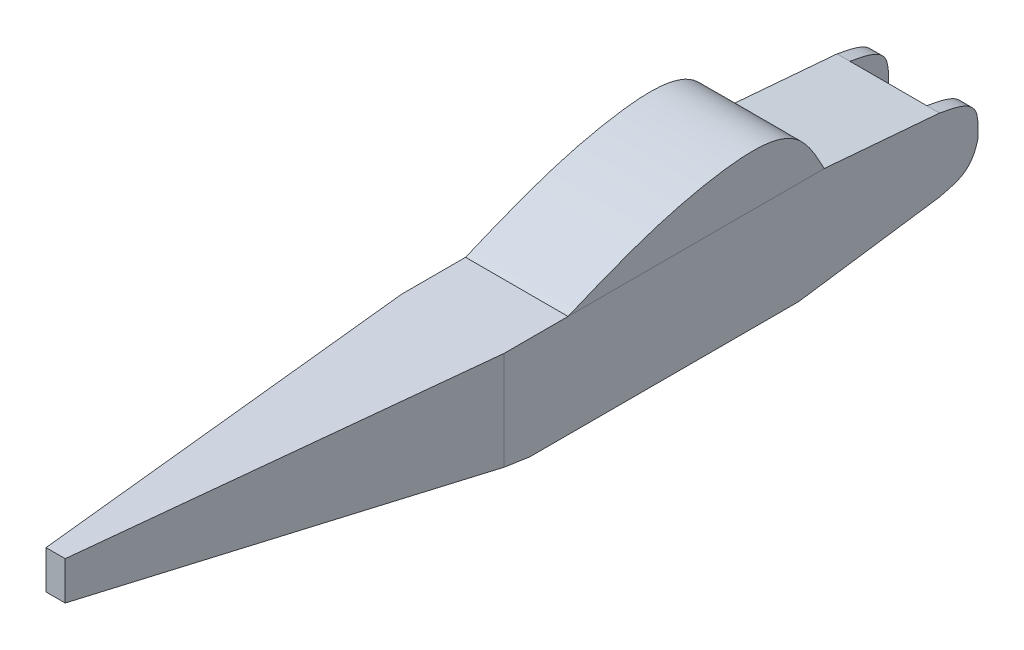
ISO-10303-21;
HEADER;
FILE_DESCRIPTION(('STEP AP214'),'2;1');
FILE_NAME('part.step','',(''),(''),'','','');
FILE_SCHEMA(('AUTOMOTIVE_DESIGN { 1 0 10303 214 1 1 1 1 }'));
ENDSEC;
DATA;
#1=APPLICATION_CONTEXT('core data for automotive mechanical design processes');
#2=APPLICATION_PROTOCOL_DEFINITION('international standard','automotive_design',2000,#1);
#3=PRODUCT_CONTEXT('',#1,'mechanical');
#4=PRODUCT('Part','Part','',(#3));
#5=PRODUCT_RELATED_PRODUCT_CATEGORY('part','',(#4));
#6=PRODUCT_DEFINITION_FORMATION('','',#4);
#7=PRODUCT_DEFINITION_CONTEXT('part definition',#1,'design');
#8=PRODUCT_DEFINITION('design','',#6,#7);
#9=PRODUCT_DEFINITION_SHAPE('','',#8);
#10=(LENGTH_UNIT() NAMED_UNIT(*) SI_UNIT(.MILLI.,.METRE.));
#11=(NAMED_UNIT(*) PLANE_ANGLE_UNIT() SI_UNIT($,.RADIAN.));
#12=(NAMED_UNIT(*) SI_UNIT($,.STERADIAN.) SOLID_ANGLE_UNIT());
#13=UNCERTAINTY_MEASURE_WITH_UNIT(LENGTH_MEASURE(1.E-05),#10,'distance_accuracy_value','');
#14=(GEOMETRIC_REPRESENTATION_CONTEXT(3) GLOBAL_UNCERTAINTY_ASSIGNED_CONTEXT((#13)) GLOBAL_UNIT_ASSIGNED_CONTEXT((#10,
#11,#12)) REPRESENTATION_CONTEXT('',''));
#15=CARTESIAN_POINT('',(0.,0.,0.));
#16=DIRECTION('',(0.,0.,1.));
#17=DIRECTION('',(1.,0.,0.));
#18=AXIS2_PLACEMENT_3D('',#15,#16,#17);
#19=CARTESIAN_POINT('',(80.,0.,0.));
#20=CARTESIAN_POINT('',(80.,11.9014593380871,6.29429922399345));
#21=CARTESIAN_POINT('',(80.,43.0492914360953,22.7673862492256));
#22=CARTESIAN_POINT('',(80.,38.0082211599049,108.644216453496));
#23=CARTESIAN_POINT('',(80.,15.2059546257476,163.451278249423));
#24=CARTESIAN_POINT('',(80.,0.,200.));
#25=B_SPLINE_CURVE_WITH_KNOTS('',3,(#19,#20,#21,#22,#23,#24),.UNSPECIFIED.,.F.,.F.,(4,1,1,4),
(0.,0.170815498021936,0.447048744274421,1.),.UNSPECIFIED.);
#26=DIRECTION('',(-1.,0.,0.));
#27=VECTOR('',#26,1.);
#28=SURFACE_OF_LINEAR_EXTRUSION('',#25,#27);
#29=CARTESIAN_POINT('',(0.,0.,0.));
#30=CARTESIAN_POINT('',(0.,11.9014593380871,6.29429922399345));
#31=CARTESIAN_POINT('',(0.,43.0492914360953,22.7673862492256));
#32=CARTESIAN_POINT('',(0.,38.0082211599049,108.644216453496));
#33=CARTESIAN_POINT('',(0.,15.2059546257476,163.451278249423));
#34=CARTESIAN_POINT('',(0.,0.,200.));
#35=B_SPLINE_CURVE_WITH_KNOTS('',3,(#29,#30,#31,#32,#33,#34),.UNSPECIFIED.,.F.,.F.,(4,1,1,4),
(0.,0.170815498021936,0.447048744274421,1.),.UNSPECIFIED.);
#36=CARTESIAN_POINT('',(0.,0.,0.));
#37=VERTEX_POINT('',#36);
#38=CARTESIAN_POINT('',(0.,0.,200.));
#39=VERTEX_POINT('',#38);
#40=EDGE_CURVE('E67',#37,#39,#35,.T.);
#41=ORIENTED_EDGE('',*,*,#40,.T.);
#42=DIRECTION('',(-1.,0.,0.));
#43=VECTOR('',#42,1.);
#44=CARTESIAN_POINT('',(80.,0.,200.));
#45=LINE('',#44,#43);
#46=CARTESIAN_POINT('',(80.,0.,200.));
#47=VERTEX_POINT('',#46);
#48=EDGE_CURVE('E12',#47,#39,#45,.T.);
#49=ORIENTED_EDGE('',*,*,#48,.F.);
#50=CARTESIAN_POINT('',(80.,0.,0.));
#51=VERTEX_POINT('',#50);
#52=EDGE_CURVE('E69',#51,#47,#25,.T.);
#53=ORIENTED_EDGE('',*,*,#52,.F.);
#54=DIRECTION('',(-1.,0.,0.));
#55=VECTOR('',#54,1.);
#56=CARTESIAN_POINT('',(80.,0.,0.));
#57=LINE('',#56,#55);
#58=EDGE_CURVE('E47',#51,#37,#57,.T.);
#59=ORIENTED_EDGE('',*,*,#58,.T.);
#60=EDGE_LOOP('',(#41,#49,#53,#59));
#61=FACE_BOUND('',#60,.T.);
#62=ADVANCED_FACE('F39',(#61),#28,.F.);
#63=CARTESIAN_POINT('',(80.,0.,200.));
#64=DIRECTION('',(0.,1.,0.));
#65=DIRECTION('',(0.,0.,1.));
#66=AXIS2_PLACEMENT_3D('',#63,#64,#65);
#67=PLANE('',#66);
#68=DIRECTION('',(0.,0.,-1.));
#69=VECTOR('',#68,1.);
#70=CARTESIAN_POINT('',(0.,0.,200.));
#71=LINE('',#70,#69);
#72=EDGE_CURVE('E64',#39,#37,#71,.T.);
#73=ORIENTED_EDGE('',*,*,#72,.T.);
#74=ORIENTED_EDGE('',*,*,#58,.F.);
#75=DIRECTION('',(0.,0.,-1.));
#76=VECTOR('',#75,1.);
#77=CARTESIAN_POINT('',(80.,0.,200.));
#78=LINE('',#77,#76);
#79=EDGE_CURVE('E53',#47,#51,#78,.T.);
#80=ORIENTED_EDGE('',*,*,#79,.F.);
#81=ORIENTED_EDGE('',*,*,#48,.T.);
#82=EDGE_LOOP('',(#73,#74,#80,#81));
#83=FACE_BOUND('',#82,.T.);
#84=ADVANCED_FACE('F72',(#83),#67,.F.);
#85=CARTESIAN_POINT('',(80.,35.1265905031986,95.4612737719037));
#86=DIRECTION('',(-1.,0.,0.));
#87=DIRECTION('',(0.,0.,1.));
#88=AXIS2_PLACEMENT_3D('',#85,#86,#87);
#89=PLANE('',#88);
#90=ORIENTED_EDGE('',*,*,#52,.T.);
#91=ORIENTED_EDGE('',*,*,#79,.T.);
#92=EDGE_LOOP('',(#90,#91));
#93=FACE_BOUND('',#92,.T.);
#94=ADVANCED_FACE('F88',(#93),#89,.F.);
#95=CARTESIAN_POINT('',(0.,35.1265905031986,95.4612737719037));
#96=DIRECTION('',(-1.,0.,0.));
#97=DIRECTION('',(0.,0.,1.));
#98=AXIS2_PLACEMENT_3D('',#95,#96,#97);
#99=PLANE('',#98);
#100=ORIENTED_EDGE('',*,*,#40,.F.);
#101=ORIENTED_EDGE('',*,*,#72,.F.);
#102=EDGE_LOOP('',(#100,#101));
#103=FACE_BOUND('',#102,.T.);
#104=ADVANCED_FACE('F65',(#103),#99,.T.);
#105=CLOSED_SHELL('',(#62,#84,#94,#104));
#106=MANIFOLD_SOLID_BREP('B2',#105);
#107=CARTESIAN_POINT('',(80.,-10.,-120.));
#108=DIRECTION('',(0.,0.,1.));
#109=DIRECTION('',(1.,0.,0.));
#110=AXIS2_PLACEMENT_3D('',#107,#108,#109);
#111=PLANE('',#110);
#112=DIRECTION('',(1.,0.,0.));
#113=VECTOR('',#112,1.);
#114=CARTESIAN_POINT('',(-100.,-28.8563423839718,-120.));
#115=LINE('',#114,#113);
#116=CARTESIAN_POINT('',(0.,-28.8563423839719,-120.));
#117=VERTEX_POINT('',#116);
#118=CARTESIAN_POINT('',(9.99999999999999,-28.8563423839719,-120.));
#119=VERTEX_POINT('',#118);
#120=EDGE_CURVE('E302',#117,#119,#115,.T.);
#121=ORIENTED_EDGE('',*,*,#120,.T.);
#122=DIRECTION('',(0.,-1.,0.));
#123=VECTOR('',#122,1.);
#124=CARTESIAN_POINT('',(9.99999999999999,-10.,-120.));
#125=LINE('',#124,#123);
#126=CARTESIAN_POINT('',(9.99999999999999,-39.7725216168353,-120.));
#127=VERTEX_POINT('',#126);
#128=EDGE_CURVE('E251',#119,#127,#125,.T.);
#129=ORIENTED_EDGE('',*,*,#128,.T.);
#130=DIRECTION('',(1.,0.,0.));
#131=VECTOR('',#130,1.);
#132=CARTESIAN_POINT('',(-100.,-39.7725216168353,-120.));
#133=LINE('',#132,#131);
#134=CARTESIAN_POINT('',(0.,-39.7725216168353,-120.));
#135=VERTEX_POINT('',#134);
#136=EDGE_CURVE('E239',#135,#127,#133,.T.);
#137=ORIENTED_EDGE('',*,*,#136,.F.);
#138=DIRECTION('',(0.,1.,0.));
#139=VECTOR('',#138,1.);
#140=CARTESIAN_POINT('',(0.,-10.,-120.));
#141=LINE('',#140,#139);
#142=EDGE_CURVE('E335',#135,#117,#141,.T.);
#143=ORIENTED_EDGE('',*,*,#142,.T.);
#144=EDGE_LOOP('',(#121,#129,#137,#143));
#145=FACE_BOUND('',#144,.T.);
#146=ADVANCED_FACE('F114',(#145),#111,.F.);
#147=CARTESIAN_POINT('',(-100.,-7.5,-90.));
#148=CARTESIAN_POINT('',(-100.,-9.78552271861447,-102.569578593505));
#149=CARTESIAN_POINT('',(-100.,-12.6209908081154,-118.163665106004));
#150=CARTESIAN_POINT('',(-100.,-26.2189816750571,-119.701695557672));
#151=CARTESIAN_POINT('',(-100.,-28.8563423839719,-120.));
#152=B_SPLINE_CURVE_WITH_KNOTS('',3,(#147,#148,#149,#150,#151),.UNSPECIFIED.,.F.,.F.,(4,1,4),
(0.,0.806047765826455,1.),.UNSPECIFIED.);
#153=DIRECTION('',(1.,0.,0.));
#154=VECTOR('',#153,1.);
#155=SURFACE_OF_LINEAR_EXTRUSION('',#152,#154);
#156=DIRECTION('',(1.,0.,0.));
#157=VECTOR('',#156,1.);
#158=CARTESIAN_POINT('',(-100.,-7.5,-90.));
#159=LINE('',#158,#157);
#160=CARTESIAN_POINT('',(0.,-7.5,-90.));
#161=VERTEX_POINT('',#160);
#162=CARTESIAN_POINT('',(10.,-7.50000000000001,-90.));
#163=VERTEX_POINT('',#162);
#164=EDGE_CURVE('E295',#161,#163,#159,.T.);
#165=ORIENTED_EDGE('',*,*,#164,.T.);
#166=CARTESIAN_POINT('',(9.99999999999999,-7.5,-90.));
#167=CARTESIAN_POINT('',(9.99999999999999,-9.78552271861447,-102.569578593505));
#168=CARTESIAN_POINT('',(9.99999999999999,-12.6209908081154,-118.163665106004));
#169=CARTESIAN_POINT('',(9.99999999999999,-26.2189816750571,-119.701695557672));
#170=CARTESIAN_POINT('',(9.99999999999999,-28.8563423839719,-120.));
#171=B_SPLINE_CURVE_WITH_KNOTS('',3,(#166,#167,#168,#169,#170),.UNSPECIFIED.,.F.,.F.,(4,1,4),
(0.,0.806047765826455,1.),.UNSPECIFIED.);
#172=EDGE_CURVE('E234',#163,#119,#171,.T.);
#173=ORIENTED_EDGE('',*,*,#172,.T.);
#174=ORIENTED_EDGE('',*,*,#120,.F.);
#175=CARTESIAN_POINT('',(0.,-7.5,-90.));
#176=CARTESIAN_POINT('',(0.,-9.78552271861447,-102.569578593505));
#177=CARTESIAN_POINT('',(0.,-12.6209908081154,-118.163665106004));
#178=CARTESIAN_POINT('',(0.,-26.2189816750571,-119.701695557672));
#179=CARTESIAN_POINT('',(0.,-28.8563423839719,-120.));
#180=B_SPLINE_CURVE_WITH_KNOTS('',3,(#175,#176,#177,#178,#179),.UNSPECIFIED.,.F.,.F.,(4,1,4),
(0.,0.806047765826455,1.),.UNSPECIFIED.);
#181=EDGE_CURVE('E373',#117,#161,#180,.F.);
#182=ORIENTED_EDGE('',*,*,#181,.T.);
#183=EDGE_LOOP('',(#165,#173,#174,#182));
#184=FACE_BOUND('',#183,.T.);
#185=ADVANCED_FACE('F285',(#184),#155,.F.);
#186=CARTESIAN_POINT('',(-100.,-39.7725216168353,-120.));
#187=CARTESIAN_POINT('',(-100.,-60.6770112525162,-114.843141558681));
#188=CARTESIAN_POINT('',(-100.,-60.9123602708052,-101.38592470322));
#189=CARTESIAN_POINT('',(-100.,-64.2857142857143,-90.));
#190=B_SPLINE_CURVE_WITH_KNOTS('',3,(#186,#187,#188,#189),.UNSPECIFIED.,.F.,.F.,(4,4),(0.,1.),.UNSPECIFIED.);
#191=DIRECTION('',(1.,0.,0.));
#192=VECTOR('',#191,1.);
#193=SURFACE_OF_LINEAR_EXTRUSION('',#190,#192);
#194=ORIENTED_EDGE('',*,*,#136,.T.);
#195=CARTESIAN_POINT('',(9.99999999999999,-39.7725216168353,-120.));
#196=CARTESIAN_POINT('',(9.99999999999999,-60.6770112525162,-114.843141558681));
#197=CARTESIAN_POINT('',(9.99999999999999,-60.9123602708052,-101.38592470322));
#198=CARTESIAN_POINT('',(9.99999999999999,-64.2857142857143,-90.));
#199=B_SPLINE_CURVE_WITH_KNOTS('',3,(#195,#196,#197,#198),.UNSPECIFIED.,.F.,.F.,(4,4),(0.,1.),.UNSPECIFIED.);
#200=CARTESIAN_POINT('',(10.,-64.2857142857143,-90.));
#201=VERTEX_POINT('',#200);
#202=EDGE_CURVE('E37',#127,#201,#199,.T.);
#203=ORIENTED_EDGE('',*,*,#202,.T.);
#204=DIRECTION('',(1.,0.,0.));
#205=VECTOR('',#204,1.);
#206=CARTESIAN_POINT('',(-100.,-64.2857142857143,-90.));
#207=LINE('',#206,#205);
#208=CARTESIAN_POINT('',(0.,-64.2857142857143,-90.));
#209=VERTEX_POINT('',#208);
#210=EDGE_CURVE('E138',#209,#201,#207,.T.);
#211=ORIENTED_EDGE('',*,*,#210,.F.);
#212=CARTESIAN_POINT('',(0.,-39.7725216168353,-120.));
#213=CARTESIAN_POINT('',(0.,-60.6770112525162,-114.843141558681));
#214=CARTESIAN_POINT('',(0.,-60.9123602708052,-101.38592470322));
#215=CARTESIAN_POINT('',(0.,-64.2857142857143,-90.));
#216=B_SPLINE_CURVE_WITH_KNOTS('',3,(#212,#213,#214,#215),.UNSPECIFIED.,.F.,.F.,(4,4),(0.,1.),.UNSPECIFIED.);
#217=EDGE_CURVE('E377',#209,#135,#216,.F.);
#218=ORIENTED_EDGE('',*,*,#217,.T.);
#219=EDGE_LOOP('',(#194,#203,#211,#218));
#220=FACE_BOUND('',#219,.T.);
#221=ADVANCED_FACE('F237',(#220),#193,.F.);
#222=CARTESIAN_POINT('',(80.,0.,560.));
#223=DIRECTION('',(0.,-1.,0.));
#224=DIRECTION('',(0.,0.,-1.));
#225=AXIS2_PLACEMENT_3D('',#222,#223,#224);
#226=PLANE('',#225);
#227=DIRECTION('',(0.,0.,1.));
#228=VECTOR('',#227,1.);
#229=CARTESIAN_POINT('',(0.,0.,560.));
#230=LINE('',#229,#228);
#231=CARTESIAN_POINT('',(0.,0.,0.));
#232=VERTEX_POINT('',#231);
#233=CARTESIAN_POINT('',(0.,0.,250.));
#234=VERTEX_POINT('',#233);
#235=EDGE_CURVE('E327',#232,#234,#230,.T.);
#236=ORIENTED_EDGE('',*,*,#235,.T.);
#237=DIRECTION('',(-0.104267266743309,0.,-0.99454931355156));
#238=VECTOR('',#237,1.);
#239=CARTESIAN_POINT('',(0.,0.,250.));
#240=LINE('',#239,#238);
#241=CARTESIAN_POINT('',(32.5,0.,560.));
#242=VERTEX_POINT('',#241);
#243=EDGE_CURVE('E314',#242,#234,#240,.T.);
#244=ORIENTED_EDGE('',*,*,#243,.F.);
#245=DIRECTION('',(-1.,0.,0.));
#246=VECTOR('',#245,1.);
#247=CARTESIAN_POINT('',(80.,0.,560.));
#248=LINE('',#247,#246);
#249=CARTESIAN_POINT('',(47.5,0.,560.));
#250=VERTEX_POINT('',#249);
#251=EDGE_CURVE('E365',#250,#242,#248,.T.);
#252=ORIENTED_EDGE('',*,*,#251,.F.);
#253=DIRECTION('',(-0.104267266743309,0.,0.99454931355156));
#254=VECTOR('',#253,1.);
#255=CARTESIAN_POINT('',(47.5,0.,560.));
#256=LINE('',#255,#254);
#257=CARTESIAN_POINT('',(80.,0.,250.));
#258=VERTEX_POINT('',#257);
#259=EDGE_CURVE('E309',#258,#250,#256,.T.);
#260=ORIENTED_EDGE('',*,*,#259,.F.);
#261=DIRECTION('',(0.,0.,1.));
#262=VECTOR('',#261,1.);
#263=CARTESIAN_POINT('',(80.,0.,560.));
#264=LINE('',#263,#262);
#265=CARTESIAN_POINT('',(80.,0.,0.));
#266=VERTEX_POINT('',#265);
#267=EDGE_CURVE('E339',#266,#258,#264,.T.);
#268=ORIENTED_EDGE('',*,*,#267,.F.);
#269=DIRECTION('',(-1.,0.,0.));
#270=VECTOR('',#269,1.);
#271=CARTESIAN_POINT('',(80.,0.,0.));
#272=LINE('',#271,#270);
#273=EDGE_CURVE('E354',#266,#232,#272,.T.);
#274=ORIENTED_EDGE('',*,*,#273,.T.);
#275=EDGE_LOOP('',(#236,#244,#252,#260,#268,#274));
#276=FACE_BOUND('',#275,.T.);
#277=ADVANCED_FACE('F116',(#276),#226,.F.);
#278=CARTESIAN_POINT('',(80.,-30.,560.));
#279=DIRECTION('',(0.,0.,-1.));
#280=DIRECTION('',(-1.,0.,0.));
#281=AXIS2_PLACEMENT_3D('',#278,#279,#280);
#282=PLANE('',#281);
#283=ORIENTED_EDGE('',*,*,#251,.T.);
#284=DIRECTION('',(0.,1.,0.));
#285=VECTOR('',#284,1.);
#286=CARTESIAN_POINT('',(32.5,-80.,560.));
#287=LINE('',#286,#285);
#288=CARTESIAN_POINT('',(32.5,-30.,560.));
#289=VERTEX_POINT('',#288);
#290=EDGE_CURVE('E317',#289,#242,#287,.T.);
#291=ORIENTED_EDGE('',*,*,#290,.F.);
#292=DIRECTION('',(-1.,0.,0.));
#293=VECTOR('',#292,1.);
#294=CARTESIAN_POINT('',(80.,-30.,560.));
#295=LINE('',#294,#293);
#296=CARTESIAN_POINT('',(47.5,-30.,560.));
#297=VERTEX_POINT('',#296);
#298=EDGE_CURVE('E362',#297,#289,#295,.T.);
#299=ORIENTED_EDGE('',*,*,#298,.F.);
#300=DIRECTION('',(0.,1.,0.));
#301=VECTOR('',#300,1.);
#302=CARTESIAN_POINT('',(47.5,-80.,560.));
#303=LINE('',#302,#301);
#304=EDGE_CURVE('E316',#297,#250,#303,.T.);
#305=ORIENTED_EDGE('',*,*,#304,.T.);
#306=EDGE_LOOP('',(#283,#291,#299,#305));
#307=FACE_BOUND('',#306,.T.);
#308=ADVANCED_FACE('F422',(#307),#282,.F.);
#309=CARTESIAN_POINT('',(80.,-80.,230.));
#310=DIRECTION('',(0.,0.988715504224767,-0.149805379427995));
#311=DIRECTION('',(0.,0.149805379427995,0.988715504224767));
#312=AXIS2_PLACEMENT_3D('',#309,#310,#311);
#313=PLANE('',#312);
#314=ORIENTED_EDGE('',*,*,#298,.T.);
#315=DIRECTION('',(-0.103103241444561,-0.149007015607524,-0.983446303009658));
#316=VECTOR('',#315,1.);
#317=CARTESIAN_POINT('',(-1.22406262842661,-78.7387385305933,238.324325698085));
#318=LINE('',#317,#316);
#319=CARTESIAN_POINT('',(0.,-76.969696969697,250.));
#320=VERTEX_POINT('',#319);
#321=EDGE_CURVE('E319',#289,#320,#318,.T.);
#322=ORIENTED_EDGE('',*,*,#321,.T.);
#323=DIRECTION('',(0.,-0.149805379427995,-0.988715504224767));
#324=VECTOR('',#323,1.);
#325=CARTESIAN_POINT('',(0.,-80.,230.));
#326=LINE('',#325,#324);
#327=CARTESIAN_POINT('',(0.,-80.,230.));
#328=VERTEX_POINT('',#327);
#329=EDGE_CURVE('E330',#320,#328,#326,.T.);
#330=ORIENTED_EDGE('',*,*,#329,.T.);
#331=DIRECTION('',(-1.,0.,0.));
#332=VECTOR('',#331,1.);
#333=CARTESIAN_POINT('',(80.,-80.,230.));
#334=LINE('',#333,#332);
#335=CARTESIAN_POINT('',(80.,-80.,230.));
#336=VERTEX_POINT('',#335);
#337=EDGE_CURVE('E359',#336,#328,#334,.T.);
#338=ORIENTED_EDGE('',*,*,#337,.F.);
#339=DIRECTION('',(0.,-0.149805379427995,-0.988715504224767));
#340=VECTOR('',#339,1.);
#341=CARTESIAN_POINT('',(80.,-80.,230.));
#342=LINE('',#341,#340);
#343=CARTESIAN_POINT('',(80.,-76.969696969697,250.));
#344=VERTEX_POINT('',#343);
#345=EDGE_CURVE('E342',#344,#336,#342,.T.);
#346=ORIENTED_EDGE('',*,*,#345,.F.);
#347=DIRECTION('',(-0.103103241444561,0.149007015607524,0.983446303009658));
#348=VECTOR('',#347,1.);
#349=CARTESIAN_POINT('',(82.0744849001366,-79.9677870351625,230.212605567928));
#350=LINE('',#349,#348);
#351=EDGE_CURVE('E324',#344,#297,#350,.T.);
#352=ORIENTED_EDGE('',*,*,#351,.T.);
#353=EDGE_LOOP('',(#314,#322,#330,#338,#346,#352));
#354=FACE_BOUND('',#353,.T.);
#355=ADVANCED_FACE('F425',(#354),#313,.F.);
#356=CARTESIAN_POINT('',(80.,-80.,20.));
#357=DIRECTION('',(0.,1.,0.));
#358=DIRECTION('',(0.,0.,1.));
#359=AXIS2_PLACEMENT_3D('',#356,#357,#358);
#360=PLANE('',#359);
#361=DIRECTION('',(0.,0.,-1.));
#362=VECTOR('',#361,1.);
#363=CARTESIAN_POINT('',(0.,-80.,20.));
#364=LINE('',#363,#362);
#365=CARTESIAN_POINT('',(0.,-80.,20.));
#366=VERTEX_POINT('',#365);
#367=EDGE_CURVE('E332',#328,#366,#364,.T.);
#368=ORIENTED_EDGE('',*,*,#367,.T.);
#369=DIRECTION('',(-1.,0.,0.));
#370=VECTOR('',#369,1.);
#371=CARTESIAN_POINT('',(80.,-80.,20.));
#372=LINE('',#371,#370);
#373=CARTESIAN_POINT('',(80.,-80.,20.));
#374=VERTEX_POINT('',#373);
#375=EDGE_CURVE('E357',#374,#366,#372,.T.);
#376=ORIENTED_EDGE('',*,*,#375,.F.);
#377=DIRECTION('',(0.,0.,-1.));
#378=VECTOR('',#377,1.);
#379=CARTESIAN_POINT('',(80.,-80.,20.));
#380=LINE('',#379,#378);
#381=EDGE_CURVE('E344',#336,#374,#380,.T.);
#382=ORIENTED_EDGE('',*,*,#381,.F.);
#383=ORIENTED_EDGE('',*,*,#337,.T.);
#384=EDGE_LOOP('',(#368,#376,#382,#383));
#385=FACE_BOUND('',#384,.T.);
#386=ADVANCED_FACE('F431',(#385),#360,.F.);
#387=CARTESIAN_POINT('',(80.,-60.,-120.));
#388=DIRECTION('',(0.,0.989949493661166,0.141421356237309));
#389=DIRECTION('',(0.,-0.141421356237309,0.989949493661167));
#390=AXIS2_PLACEMENT_3D('',#387,#388,#389);
#391=PLANE('',#390);
#392=DIRECTION('',(0.,0.141421356237309,-0.989949493661166));
#393=VECTOR('',#392,1.);
#394=CARTESIAN_POINT('',(0.,-60.,-120.));
#395=LINE('',#394,#393);
#396=EDGE_CURVE('E244',#366,#209,#395,.T.);
#397=ORIENTED_EDGE('',*,*,#396,.T.);
#398=ORIENTED_EDGE('',*,*,#210,.T.);
#399=CARTESIAN_POINT('',(70.,-64.2857142857143,-90.));
#400=VERTEX_POINT('',#399);
#401=EDGE_CURVE('E222',#201,#400,#207,.T.);
#402=ORIENTED_EDGE('',*,*,#401,.T.);
#403=CARTESIAN_POINT('',(80.,-64.2857142857143,-90.));
#404=VERTEX_POINT('',#403);
#405=EDGE_CURVE('E228',#400,#404,#207,.T.);
#406=ORIENTED_EDGE('',*,*,#405,.T.);
#407=DIRECTION('',(0.,0.141421356237309,-0.989949493661166));
#408=VECTOR('',#407,1.);
#409=CARTESIAN_POINT('',(80.,-60.,-120.));
#410=LINE('',#409,#408);
#411=EDGE_CURVE('E346',#374,#404,#410,.T.);
#412=ORIENTED_EDGE('',*,*,#411,.F.);
#413=ORIENTED_EDGE('',*,*,#375,.T.);
#414=EDGE_LOOP('',(#397,#398,#402,#406,#412,#413));
#415=FACE_BOUND('',#414,.T.);
#416=ADVANCED_FACE('F241',(#415),#391,.F.);
#417=CARTESIAN_POINT('',(70.,-39.7725216168353,-120.));
#418=VERTEX_POINT('',#417);
#419=CARTESIAN_POINT('',(80.,-39.7725216168353,-120.));
#420=VERTEX_POINT('',#419);
#421=EDGE_CURVE('E245',#418,#420,#133,.T.);
#422=ORIENTED_EDGE('',*,*,#421,.F.);
#423=DIRECTION('',(0.,1.,0.));
#424=VECTOR('',#423,1.);
#425=CARTESIAN_POINT('',(70.,-10.,-120.));
#426=LINE('',#425,#424);
#427=CARTESIAN_POINT('',(70.,-28.8563423839719,-120.));
#428=VERTEX_POINT('',#427);
#429=EDGE_CURVE('E399',#418,#428,#426,.T.);
#430=ORIENTED_EDGE('',*,*,#429,.T.);
#431=CARTESIAN_POINT('',(80.,-28.8563423839718,-120.));
#432=VERTEX_POINT('',#431);
#433=EDGE_CURVE('E304',#428,#432,#115,.T.);
#434=ORIENTED_EDGE('',*,*,#433,.T.);
#435=DIRECTION('',(0.,1.,0.));
#436=VECTOR('',#435,1.);
#437=CARTESIAN_POINT('',(80.,-10.,-120.));
#438=LINE('',#437,#436);
#439=EDGE_CURVE('E349',#420,#432,#438,.T.);
#440=ORIENTED_EDGE('',*,*,#439,.F.);
#441=EDGE_LOOP('',(#422,#430,#434,#440));
#442=FACE_BOUND('',#441,.T.);
#443=ADVANCED_FACE('F398',(#442),#111,.F.);
#444=CARTESIAN_POINT('',(80.,0.,0.));
#445=DIRECTION('',(0.,-0.99654575824488,0.08304547985374));
#446=DIRECTION('',(0.,-0.08304547985374,-0.99654575824488));
#447=AXIS2_PLACEMENT_3D('',#444,#445,#446);
#448=PLANE('',#447);
#449=DIRECTION('',(0.,0.08304547985374,0.99654575824488));
#450=VECTOR('',#449,1.);
#451=CARTESIAN_POINT('',(80.,0.,0.));
#452=LINE('',#451,#450);
#453=CARTESIAN_POINT('',(80.,-7.5,-90.));
#454=VERTEX_POINT('',#453);
#455=EDGE_CURVE('E352',#454,#266,#452,.T.);
#456=ORIENTED_EDGE('',*,*,#455,.F.);
#457=CARTESIAN_POINT('',(70.,-7.50000000000001,-90.));
#458=VERTEX_POINT('',#457);
#459=EDGE_CURVE('E301',#458,#454,#159,.T.);
#460=ORIENTED_EDGE('',*,*,#459,.F.);
#461=DIRECTION('',(1.,0.,0.));
#462=VECTOR('',#461,1.);
#463=CARTESIAN_POINT('',(40.,-7.5,-90.));
#464=LINE('',#463,#462);
#465=EDGE_CURVE('E410',#458,#163,#464,.F.);
#466=ORIENTED_EDGE('',*,*,#465,.T.);
#467=ORIENTED_EDGE('',*,*,#164,.F.);
#468=DIRECTION('',(0.,0.08304547985374,0.99654575824488));
#469=VECTOR('',#468,1.);
#470=CARTESIAN_POINT('',(0.,0.,0.));
#471=LINE('',#470,#469);
#472=EDGE_CURVE('E337',#161,#232,#471,.T.);
#473=ORIENTED_EDGE('',*,*,#472,.T.);
#474=ORIENTED_EDGE('',*,*,#273,.F.);
#475=EDGE_LOOP('',(#456,#460,#466,#467,#473,#474));
#476=FACE_BOUND('',#475,.T.);
#477=ADVANCED_FACE('F408',(#476),#448,.F.);
#478=CARTESIAN_POINT('',(80.,0.,-120.));
#479=DIRECTION('',(-1.,0.,0.));
#480=DIRECTION('',(0.,0.,1.));
#481=AXIS2_PLACEMENT_3D('',#478,#479,#480);
#482=PLANE('',#481);
#483=ORIENTED_EDGE('',*,*,#411,.T.);
#484=CARTESIAN_POINT('',(80.,-39.7725216168353,-120.));
#485=CARTESIAN_POINT('',(80.,-60.6770112525162,-114.843141558681));
#486=CARTESIAN_POINT('',(80.,-60.9123602708052,-101.38592470322));
#487=CARTESIAN_POINT('',(80.,-64.2857142857143,-90.));
#488=B_SPLINE_CURVE_WITH_KNOTS('',3,(#484,#485,#486,#487),.UNSPECIFIED.,.F.,.F.,(4,4),(0.,1.),.UNSPECIFIED.);
#489=EDGE_CURVE('E292',#404,#420,#488,.F.);
#490=ORIENTED_EDGE('',*,*,#489,.T.);
#491=ORIENTED_EDGE('',*,*,#439,.T.);
#492=CARTESIAN_POINT('',(80.,-7.5,-90.));
#493=CARTESIAN_POINT('',(80.,-9.78552271861447,-102.569578593505));
#494=CARTESIAN_POINT('',(80.,-12.6209908081154,-118.163665106004));
#495=CARTESIAN_POINT('',(80.,-26.2189816750571,-119.701695557672));
#496=CARTESIAN_POINT('',(80.,-28.8563423839719,-120.));
#497=B_SPLINE_CURVE_WITH_KNOTS('',3,(#492,#493,#494,#495,#496),.UNSPECIFIED.,.F.,.F.,(4,1,4),
(0.,0.806047765826455,1.),.UNSPECIFIED.);
#498=EDGE_CURVE('E300',#432,#454,#497,.F.);
#499=ORIENTED_EDGE('',*,*,#498,.T.);
#500=ORIENTED_EDGE('',*,*,#455,.T.);
#501=ORIENTED_EDGE('',*,*,#267,.T.);
#502=DIRECTION('',(0.,-1.,0.));
#503=VECTOR('',#502,1.);
#504=CARTESIAN_POINT('',(80.,0.,250.));
#505=LINE('',#504,#503);
#506=EDGE_CURVE('E370',#258,#344,#505,.T.);
#507=ORIENTED_EDGE('',*,*,#506,.T.);
#508=ORIENTED_EDGE('',*,*,#345,.T.);
#509=ORIENTED_EDGE('',*,*,#381,.T.);
#510=EDGE_LOOP('',(#483,#490,#491,#499,#500,#501,#507,#508,#509));
#511=FACE_BOUND('',#510,.T.);
#512=ADVANCED_FACE('F403',(#511),#482,.F.);
#513=CARTESIAN_POINT('',(0.,0.,-120.));
#514=DIRECTION('',(-1.,0.,0.));
#515=DIRECTION('',(0.,0.,1.));
#516=AXIS2_PLACEMENT_3D('',#513,#514,#515);
#517=PLANE('',#516);
#518=ORIENTED_EDGE('',*,*,#217,.F.);
#519=ORIENTED_EDGE('',*,*,#396,.F.);
#520=ORIENTED_EDGE('',*,*,#367,.F.);
#521=ORIENTED_EDGE('',*,*,#329,.F.);
#522=DIRECTION('',(0.,-1.,0.));
#523=VECTOR('',#522,1.);
#524=CARTESIAN_POINT('',(0.,0.,250.));
#525=LINE('',#524,#523);
#526=EDGE_CURVE('E368',#234,#320,#525,.T.);
#527=ORIENTED_EDGE('',*,*,#526,.F.);
#528=ORIENTED_EDGE('',*,*,#235,.F.);
#529=ORIENTED_EDGE('',*,*,#472,.F.);
#530=ORIENTED_EDGE('',*,*,#181,.F.);
#531=ORIENTED_EDGE('',*,*,#142,.F.);
#532=EDGE_LOOP('',(#518,#519,#520,#521,#527,#528,#529,#530,#531));
#533=FACE_BOUND('',#532,.T.);
#534=ADVANCED_FACE('F434',(#533),#517,.T.);
#535=CARTESIAN_POINT('',(0.,-80.,250.));
#536=DIRECTION('',(0.99454931355156,0.,-0.104267266743309));
#537=DIRECTION('',(-0.104267266743309,0.,-0.99454931355156));
#538=AXIS2_PLACEMENT_3D('',#535,#536,#537);
#539=PLANE('',#538);
#540=ORIENTED_EDGE('',*,*,#290,.T.);
#541=ORIENTED_EDGE('',*,*,#243,.T.);
#542=ORIENTED_EDGE('',*,*,#526,.T.);
#543=ORIENTED_EDGE('',*,*,#321,.F.);
#544=EDGE_LOOP('',(#540,#541,#542,#543));
#545=FACE_BOUND('',#544,.T.);
#546=ADVANCED_FACE('F286',(#545),#539,.F.);
#547=CARTESIAN_POINT('',(47.5,-80.,560.));
#548=DIRECTION('',(-0.99454931355156,0.,-0.104267266743309));
#549=DIRECTION('',(-0.104267266743309,0.,0.99454931355156));
#550=AXIS2_PLACEMENT_3D('',#547,#548,#549);
#551=PLANE('',#550);
#552=ORIENTED_EDGE('',*,*,#506,.F.);
#553=ORIENTED_EDGE('',*,*,#259,.T.);
#554=ORIENTED_EDGE('',*,*,#304,.F.);
#555=ORIENTED_EDGE('',*,*,#351,.F.);
#556=EDGE_LOOP('',(#552,#553,#554,#555));
#557=FACE_BOUND('',#556,.T.);
#558=ADVANCED_FACE('F283',(#557),#551,.F.);
#559=ORIENTED_EDGE('',*,*,#433,.F.);
#560=CARTESIAN_POINT('',(70.,-7.5,-90.));
#561=CARTESIAN_POINT('',(70.,-9.78552271861447,-102.569578593505));
#562=CARTESIAN_POINT('',(70.,-12.6209908081154,-118.163665106004));
#563=CARTESIAN_POINT('',(70.,-26.2189816750571,-119.701695557672));
#564=CARTESIAN_POINT('',(70.,-28.8563423839719,-120.));
#565=B_SPLINE_CURVE_WITH_KNOTS('',3,(#560,#561,#562,#563,#564),.UNSPECIFIED.,.F.,.F.,(4,1,4),
(0.,0.806047765826455,1.),.UNSPECIFIED.);
#566=EDGE_CURVE('E257',#428,#458,#565,.F.);
#567=ORIENTED_EDGE('',*,*,#566,.T.);
#568=ORIENTED_EDGE('',*,*,#459,.T.);
#569=ORIENTED_EDGE('',*,*,#498,.F.);
#570=EDGE_LOOP('',(#559,#567,#568,#569));
#571=FACE_BOUND('',#570,.T.);
#572=ADVANCED_FACE('F277',(#571),#155,.F.);
#573=ORIENTED_EDGE('',*,*,#405,.F.);
#574=CARTESIAN_POINT('',(70.,-39.7725216168353,-120.));
#575=CARTESIAN_POINT('',(70.,-60.6770112525162,-114.843141558681));
#576=CARTESIAN_POINT('',(70.,-60.9123602708052,-101.38592470322));
#577=CARTESIAN_POINT('',(70.,-64.2857142857143,-90.));
#578=B_SPLINE_CURVE_WITH_KNOTS('',3,(#574,#575,#576,#577),.UNSPECIFIED.,.F.,.F.,(4,4),(0.,1.),.UNSPECIFIED.);
#579=EDGE_CURVE('E124',#400,#418,#578,.F.);
#580=ORIENTED_EDGE('',*,*,#579,.T.);
#581=ORIENTED_EDGE('',*,*,#421,.T.);
#582=ORIENTED_EDGE('',*,*,#489,.F.);
#583=EDGE_LOOP('',(#573,#580,#581,#582));
#584=FACE_BOUND('',#583,.T.);
#585=ADVANCED_FACE('F273',(#584),#193,.F.);
#586=CARTESIAN_POINT('',(9.99999999999999,-200.,-143.972449548079));
#587=DIRECTION('',(-1.,0.,0.));
#588=DIRECTION('',(0.,0.,1.));
#589=AXIS2_PLACEMENT_3D('',#586,#587,#588);
#590=PLANE('',#589);
#591=DIRECTION('',(0.,1.,0.));
#592=VECTOR('',#591,1.);
#593=CARTESIAN_POINT('',(10.,-200.,-90.));
#594=LINE('',#593,#592);
#595=EDGE_CURVE('E225',#201,#163,#594,.T.);
#596=ORIENTED_EDGE('',*,*,#595,.F.);
#597=ORIENTED_EDGE('',*,*,#202,.F.);
#598=ORIENTED_EDGE('',*,*,#128,.F.);
#599=ORIENTED_EDGE('',*,*,#172,.F.);
#600=EDGE_LOOP('',(#596,#597,#598,#599));
#601=FACE_BOUND('',#600,.T.);
#602=ADVANCED_FACE('F231',(#601),#590,.F.);
#603=CARTESIAN_POINT('',(70.,-200.,-143.972449548079));
#604=DIRECTION('',(1.,0.,0.));
#605=DIRECTION('',(0.,0.,-1.));
#606=AXIS2_PLACEMENT_3D('',#603,#604,#605);
#607=PLANE('',#606);
#608=ORIENTED_EDGE('',*,*,#429,.F.);
#609=ORIENTED_EDGE('',*,*,#579,.F.);
#610=DIRECTION('',(0.,1.,0.));
#611=VECTOR('',#610,1.);
#612=CARTESIAN_POINT('',(70.,-200.,-90.));
#613=LINE('',#612,#611);
#614=EDGE_CURVE('E131',#400,#458,#613,.T.);
#615=ORIENTED_EDGE('',*,*,#614,.T.);
#616=ORIENTED_EDGE('',*,*,#566,.F.);
#617=EDGE_LOOP('',(#608,#609,#615,#616));
#618=FACE_BOUND('',#617,.T.);
#619=ADVANCED_FACE('F488',(#618),#607,.F.);
#620=CARTESIAN_POINT('',(10.,-200.,-90.));
#621=DIRECTION('',(0.,0.,1.));
#622=DIRECTION('',(1.,0.,0.));
#623=AXIS2_PLACEMENT_3D('',#620,#621,#622);
#624=PLANE('',#623);
#625=ORIENTED_EDGE('',*,*,#614,.F.);
#626=ORIENTED_EDGE('',*,*,#401,.F.);
#627=ORIENTED_EDGE('',*,*,#595,.T.);
#628=ORIENTED_EDGE('',*,*,#465,.F.);
#629=EDGE_LOOP('',(#625,#626,#627,#628));
#630=FACE_BOUND('',#629,.T.);
#631=ADVANCED_FACE('F224',(#630),#624,.F.);
#632=CLOSED_SHELL('',(#146,#185,#221,#277,#308,#355,#386,#416,#443,#477,#512,#534,#546,#558,
#572,#585,#602,#619,#631));
#633=MANIFOLD_SOLID_BREP('B6',#632);
#634=ADVANCED_BREP_SHAPE_REPRESENTATION('',(#18,#106,#633),#14);
#635=SHAPE_DEFINITION_REPRESENTATION(#9,#634);
ENDSEC;
END-ISO-10303-21;
